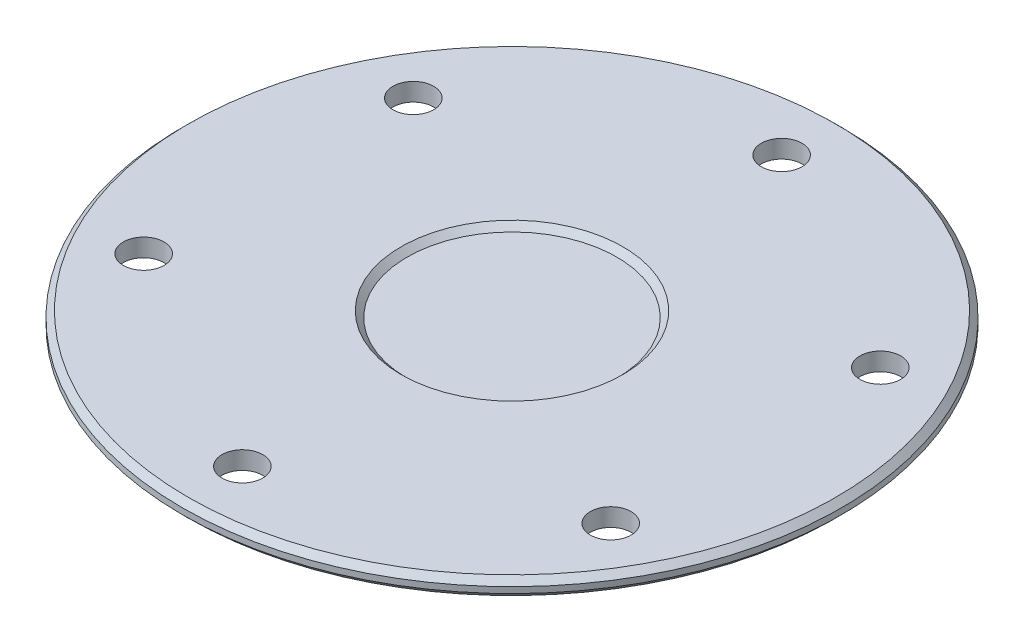
ISO-10303-21;
HEADER;
FILE_DESCRIPTION(('STEP AP214'),'2;1');
FILE_NAME('part.step','',(''),(''),'','','');
FILE_SCHEMA(('AUTOMOTIVE_DESIGN { 1 0 10303 214 1 1 1 1 }'));
ENDSEC;
DATA;
#1=APPLICATION_CONTEXT('core data for automotive mechanical design processes');
#2=APPLICATION_PROTOCOL_DEFINITION('international standard','automotive_design',2000,#1);
#3=PRODUCT_CONTEXT('',#1,'mechanical');
#4=PRODUCT('Part','Part','',(#3));
#5=PRODUCT_RELATED_PRODUCT_CATEGORY('part','',(#4));
#6=PRODUCT_DEFINITION_FORMATION('','',#4);
#7=PRODUCT_DEFINITION_CONTEXT('part definition',#1,'design');
#8=PRODUCT_DEFINITION('design','',#6,#7);
#9=PRODUCT_DEFINITION_SHAPE('','',#8);
#10=(LENGTH_UNIT() NAMED_UNIT(*) SI_UNIT(.MILLI.,.METRE.));
#11=(NAMED_UNIT(*) PLANE_ANGLE_UNIT() SI_UNIT($,.RADIAN.));
#12=(NAMED_UNIT(*) SI_UNIT($,.STERADIAN.) SOLID_ANGLE_UNIT());
#13=UNCERTAINTY_MEASURE_WITH_UNIT(LENGTH_MEASURE(1.E-05),#10,'distance_accuracy_value','');
#14=(GEOMETRIC_REPRESENTATION_CONTEXT(3) GLOBAL_UNCERTAINTY_ASSIGNED_CONTEXT((#13)) GLOBAL_UNIT_ASSIGNED_CONTEXT((#10,
#11,#12)) REPRESENTATION_CONTEXT('',''));
#15=CARTESIAN_POINT('',(0.,0.,0.));
#16=DIRECTION('',(0.,0.,1.));
#17=DIRECTION('',(1.,0.,0.));
#18=AXIS2_PLACEMENT_3D('',#15,#16,#17);
#19=CARTESIAN_POINT('',(0.,3.,0.));
#20=DIRECTION('',(0.,-1.,0.));
#21=DIRECTION('',(0.,0.,-1.));
#22=AXIS2_PLACEMENT_3D('',#19,#20,#21);
#23=CYLINDRICAL_SURFACE('',#22,55.);
#24=CARTESIAN_POINT('',(0.,1.00000000000001,0.));
#25=DIRECTION('',(0.,1.,0.));
#26=DIRECTION('',(0.,0.,1.));
#27=AXIS2_PLACEMENT_3D('',#24,#25,#26);
#28=CIRCLE('',#27,55.);
#29=CARTESIAN_POINT('',(0.,1.00000000000001,55.));
#30=VERTEX_POINT('',#29);
#31=EDGE_CURVE('E44',#30,#30,#28,.T.);
#32=ORIENTED_EDGE('',*,*,#31,.T.);
#33=EDGE_LOOP('',(#32));
#34=FACE_BOUND('',#33,.T.);
#35=CARTESIAN_POINT('',(0.,1.99999999999997,0.));
#36=DIRECTION('',(0.,1.,0.));
#37=DIRECTION('',(0.,0.,1.));
#38=AXIS2_PLACEMENT_3D('',#35,#36,#37);
#39=CIRCLE('',#38,55.);
#40=CARTESIAN_POINT('',(0.,1.99999999999997,55.));
#41=VERTEX_POINT('',#40);
#42=EDGE_CURVE('E48',#41,#41,#39,.F.);
#43=ORIENTED_EDGE('',*,*,#42,.T.);
#44=EDGE_LOOP('',(#43));
#45=FACE_BOUND('',#44,.T.);
#46=ADVANCED_FACE('F36',(#34,#45),#23,.T.);
#47=CARTESIAN_POINT('',(0.,3.,0.));
#48=DIRECTION('',(0.,1.,0.));
#49=DIRECTION('',(0.,0.,1.));
#50=AXIS2_PLACEMENT_3D('',#47,#48,#49);
#51=PLANE('',#50);
#52=CARTESIAN_POINT('',(0.,3.,0.));
#53=DIRECTION('',(0.,1.,0.));
#54=DIRECTION('',(0.,0.,1.));
#55=AXIS2_PLACEMENT_3D('',#52,#53,#54);
#56=CIRCLE('',#55,18.5);
#57=CARTESIAN_POINT('',(0.,3.,18.5));
#58=VERTEX_POINT('',#57);
#59=EDGE_CURVE('E52',#58,#58,#56,.F.);
#60=ORIENTED_EDGE('',*,*,#59,.T.);
#61=EDGE_LOOP('',(#60));
#62=FACE_BOUND('',#61,.T.);
#63=CARTESIAN_POINT('',(0.,3.,0.));
#64=DIRECTION('',(0.,1.,0.));
#65=DIRECTION('',(0.,0.,1.));
#66=AXIS2_PLACEMENT_3D('',#63,#64,#65);
#67=CIRCLE('',#66,54.);
#68=CARTESIAN_POINT('',(0.,3.,54.));
#69=VERTEX_POINT('',#68);
#70=EDGE_CURVE('E57',#69,#69,#67,.T.);
#71=ORIENTED_EDGE('',*,*,#70,.T.);
#72=EDGE_LOOP('',(#71));
#73=FACE_BOUND('',#72,.T.);
#74=CARTESIAN_POINT('',(38.9711431702995,3.,-22.5000000000005));
#75=DIRECTION('',(0.,1.,0.));
#76=DIRECTION('',(-0.866025403784433,0.,0.50000000000001));
#77=AXIS2_PLACEMENT_3D('',#74,#75,#76);
#78=CIRCLE('',#77,3.39999999999999);
#79=CARTESIAN_POINT('',(36.0266567974324,3.,-20.8000000000004));
#80=VERTEX_POINT('',#79);
#81=EDGE_CURVE('E77',#80,#80,#78,.T.);
#82=ORIENTED_EDGE('',*,*,#81,.F.);
#83=EDGE_LOOP('',(#82));
#84=FACE_BOUND('',#83,.T.);
#85=CARTESIAN_POINT('',(38.9711431703,3.,22.4999999999996));
#86=DIRECTION('',(0.,1.,0.));
#87=DIRECTION('',(-0.866025403784443,0.,-0.499999999999992));
#88=AXIS2_PLACEMENT_3D('',#85,#86,#87);
#89=CIRCLE('',#88,3.39999999999999);
#90=CARTESIAN_POINT('',(36.0266567974328,3.,20.7999999999997));
#91=VERTEX_POINT('',#90);
#92=EDGE_CURVE('E76',#91,#91,#89,.T.);
#93=ORIENTED_EDGE('',*,*,#92,.F.);
#94=EDGE_LOOP('',(#93));
#95=FACE_BOUND('',#94,.T.);
#96=CARTESIAN_POINT('',(0.,3.,45.));
#97=DIRECTION('',(0.,1.,0.));
#98=DIRECTION('',(0.,0.,-1.));
#99=AXIS2_PLACEMENT_3D('',#96,#97,#98);
#100=CIRCLE('',#99,3.39999999999999);
#101=CARTESIAN_POINT('',(0.,3.,41.6));
#102=VERTEX_POINT('',#101);
#103=EDGE_CURVE('E84',#102,#102,#100,.T.);
#104=ORIENTED_EDGE('',*,*,#103,.F.);
#105=EDGE_LOOP('',(#104));
#106=FACE_BOUND('',#105,.T.);
#107=CARTESIAN_POINT('',(-38.9711431702996,3.,22.5000000000002));
#108=DIRECTION('',(0.,1.,0.));
#109=DIRECTION('',(0.866025403784436,0.,-0.500000000000004));
#110=AXIS2_PLACEMENT_3D('',#107,#108,#109);
#111=CIRCLE('',#110,3.39999999999999);
#112=CARTESIAN_POINT('',(-36.0266567974326,3.,20.8000000000002));
#113=VERTEX_POINT('',#112);
#114=EDGE_CURVE('E90',#113,#113,#111,.T.);
#115=ORIENTED_EDGE('',*,*,#114,.F.);
#116=EDGE_LOOP('',(#115));
#117=FACE_BOUND('',#116,.T.);
#118=CARTESIAN_POINT('',(-38.9711431702998,3.,-22.4999999999999));
#119=DIRECTION('',(0.,1.,0.));
#120=DIRECTION('',(0.86602540378444,0.,0.499999999999998));
#121=AXIS2_PLACEMENT_3D('',#118,#119,#120);
#122=CIRCLE('',#121,3.39999999999999);
#123=CARTESIAN_POINT('',(-36.0266567974327,3.,-20.7999999999999));
#124=VERTEX_POINT('',#123);
#125=EDGE_CURVE('E69',#124,#124,#122,.T.);
#126=ORIENTED_EDGE('',*,*,#125,.F.);
#127=EDGE_LOOP('',(#126));
#128=FACE_BOUND('',#127,.T.);
#129=CARTESIAN_POINT('',(0.,3.,-45.));
#130=DIRECTION('',(0.,1.,0.));
#131=DIRECTION('',(0.,0.,1.));
#132=AXIS2_PLACEMENT_3D('',#129,#130,#131);
#133=CIRCLE('',#132,3.39999999999999);
#134=CARTESIAN_POINT('',(0.,3.,-41.6));
#135=VERTEX_POINT('',#134);
#136=EDGE_CURVE('E63',#135,#135,#133,.T.);
#137=ORIENTED_EDGE('',*,*,#136,.F.);
#138=EDGE_LOOP('',(#137));
#139=FACE_BOUND('',#138,.T.);
#140=ADVANCED_FACE('F118',(#62,#73,#84,#95,#106,#117,#128,#139),#51,.T.);
#141=CARTESIAN_POINT('',(0.,0.,0.));
#142=DIRECTION('',(0.,1.,0.));
#143=DIRECTION('',(0.,0.,1.));
#144=AXIS2_PLACEMENT_3D('',#141,#142,#143);
#145=PLANE('',#144);
#146=CARTESIAN_POINT('',(0.,0.,0.));
#147=DIRECTION('',(0.,1.,0.));
#148=DIRECTION('',(0.,0.,1.));
#149=AXIS2_PLACEMENT_3D('',#146,#147,#148);
#150=CIRCLE('',#149,54.);
#151=CARTESIAN_POINT('',(0.,0.,54.));
#152=VERTEX_POINT('',#151);
#153=EDGE_CURVE('E10',#152,#152,#150,.F.);
#154=ORIENTED_EDGE('',*,*,#153,.T.);
#155=EDGE_LOOP('',(#154));
#156=FACE_BOUND('',#155,.T.);
#157=CARTESIAN_POINT('',(38.9711431702995,0.,-22.5000000000005));
#158=DIRECTION('',(0.,1.,0.));
#159=DIRECTION('',(-0.866025403784433,0.,0.50000000000001));
#160=AXIS2_PLACEMENT_3D('',#157,#158,#159);
#161=CIRCLE('',#160,3.39999999999999);
#162=CARTESIAN_POINT('',(36.0266567974324,0.,-20.8000000000004));
#163=VERTEX_POINT('',#162);
#164=EDGE_CURVE('E73',#163,#163,#161,.T.);
#165=ORIENTED_EDGE('',*,*,#164,.T.);
#166=EDGE_LOOP('',(#165));
#167=FACE_BOUND('',#166,.T.);
#168=CARTESIAN_POINT('',(38.9711431703,0.,22.4999999999996));
#169=DIRECTION('',(0.,1.,0.));
#170=DIRECTION('',(-0.866025403784443,0.,-0.499999999999992));
#171=AXIS2_PLACEMENT_3D('',#168,#169,#170);
#172=CIRCLE('',#171,3.39999999999999);
#173=CARTESIAN_POINT('',(36.0266567974329,0.,20.7999999999997));
#174=VERTEX_POINT('',#173);
#175=EDGE_CURVE('E81',#174,#174,#172,.T.);
#176=ORIENTED_EDGE('',*,*,#175,.T.);
#177=EDGE_LOOP('',(#176));
#178=FACE_BOUND('',#177,.T.);
#179=CARTESIAN_POINT('',(0.,0.,45.));
#180=DIRECTION('',(0.,1.,0.));
#181=DIRECTION('',(0.,0.,-1.));
#182=AXIS2_PLACEMENT_3D('',#179,#180,#181);
#183=CIRCLE('',#182,3.39999999999999);
#184=CARTESIAN_POINT('',(0.,0.,41.6));
#185=VERTEX_POINT('',#184);
#186=EDGE_CURVE('E87',#185,#185,#183,.T.);
#187=ORIENTED_EDGE('',*,*,#186,.T.);
#188=EDGE_LOOP('',(#187));
#189=FACE_BOUND('',#188,.T.);
#190=CARTESIAN_POINT('',(-38.9711431702996,0.,22.5000000000002));
#191=DIRECTION('',(0.,1.,0.));
#192=DIRECTION('',(0.866025403784436,0.,-0.500000000000004));
#193=AXIS2_PLACEMENT_3D('',#190,#191,#192);
#194=CIRCLE('',#193,3.39999999999999);
#195=CARTESIAN_POINT('',(-36.0266567974326,0.,20.8000000000002));
#196=VERTEX_POINT('',#195);
#197=EDGE_CURVE('E72',#196,#196,#194,.T.);
#198=ORIENTED_EDGE('',*,*,#197,.T.);
#199=EDGE_LOOP('',(#198));
#200=FACE_BOUND('',#199,.T.);
#201=CARTESIAN_POINT('',(-38.9711431702998,0.,-22.4999999999999));
#202=DIRECTION('',(0.,1.,0.));
#203=DIRECTION('',(0.86602540378444,0.,0.499999999999998));
#204=AXIS2_PLACEMENT_3D('',#201,#202,#203);
#205=CIRCLE('',#204,3.39999999999999);
#206=CARTESIAN_POINT('',(-36.0266567974327,0.,-20.7999999999999));
#207=VERTEX_POINT('',#206);
#208=EDGE_CURVE('E66',#207,#207,#205,.T.);
#209=ORIENTED_EDGE('',*,*,#208,.T.);
#210=EDGE_LOOP('',(#209));
#211=FACE_BOUND('',#210,.T.);
#212=CARTESIAN_POINT('',(0.,0.,-45.));
#213=DIRECTION('',(0.,1.,0.));
#214=DIRECTION('',(0.,0.,1.));
#215=AXIS2_PLACEMENT_3D('',#212,#213,#214);
#216=CIRCLE('',#215,3.39999999999999);
#217=CARTESIAN_POINT('',(0.,0.,-41.6));
#218=VERTEX_POINT('',#217);
#219=EDGE_CURVE('E60',#218,#218,#216,.T.);
#220=ORIENTED_EDGE('',*,*,#219,.T.);
#221=EDGE_LOOP('',(#220));
#222=FACE_BOUND('',#221,.T.);
#223=ADVANCED_FACE('F122',(#156,#167,#178,#189,#200,#211,#222),#145,.F.);
#224=CARTESIAN_POINT('',(0.,3.,-45.));
#225=DIRECTION('',(0.,1.,0.));
#226=DIRECTION('',(0.,0.,1.));
#227=AXIS2_PLACEMENT_3D('',#224,#225,#226);
#228=CYLINDRICAL_SURFACE('',#227,3.39999999999999);
#229=ORIENTED_EDGE('',*,*,#136,.T.);
#230=EDGE_LOOP('',(#229));
#231=FACE_BOUND('',#230,.T.);
#232=ORIENTED_EDGE('',*,*,#219,.F.);
#233=EDGE_LOOP('',(#232));
#234=FACE_BOUND('',#233,.T.);
#235=ADVANCED_FACE('F128',(#231,#234),#228,.F.);
#236=CARTESIAN_POINT('',(-38.9711431702998,3.,-22.4999999999999));
#237=DIRECTION('',(0.,1.,0.));
#238=DIRECTION('',(0.86602540378444,0.,0.499999999999998));
#239=AXIS2_PLACEMENT_3D('',#236,#237,#238);
#240=CYLINDRICAL_SURFACE('',#239,3.39999999999999);
#241=ORIENTED_EDGE('',*,*,#125,.T.);
#242=EDGE_LOOP('',(#241));
#243=FACE_BOUND('',#242,.T.);
#244=ORIENTED_EDGE('',*,*,#208,.F.);
#245=EDGE_LOOP('',(#244));
#246=FACE_BOUND('',#245,.T.);
#247=ADVANCED_FACE('F132',(#243,#246),#240,.F.);
#248=CARTESIAN_POINT('',(-38.9711431702996,3.,22.5000000000002));
#249=DIRECTION('',(0.,1.,0.));
#250=DIRECTION('',(0.866025403784436,0.,-0.500000000000004));
#251=AXIS2_PLACEMENT_3D('',#248,#249,#250);
#252=CYLINDRICAL_SURFACE('',#251,3.39999999999999);
#253=ORIENTED_EDGE('',*,*,#114,.T.);
#254=EDGE_LOOP('',(#253));
#255=FACE_BOUND('',#254,.T.);
#256=ORIENTED_EDGE('',*,*,#197,.F.);
#257=EDGE_LOOP('',(#256));
#258=FACE_BOUND('',#257,.T.);
#259=ADVANCED_FACE('F136',(#255,#258),#252,.F.);
#260=CARTESIAN_POINT('',(0.,3.,45.));
#261=DIRECTION('',(0.,1.,0.));
#262=DIRECTION('',(0.,0.,-1.));
#263=AXIS2_PLACEMENT_3D('',#260,#261,#262);
#264=CYLINDRICAL_SURFACE('',#263,3.39999999999999);
#265=ORIENTED_EDGE('',*,*,#103,.T.);
#266=EDGE_LOOP('',(#265));
#267=FACE_BOUND('',#266,.T.);
#268=ORIENTED_EDGE('',*,*,#186,.F.);
#269=EDGE_LOOP('',(#268));
#270=FACE_BOUND('',#269,.T.);
#271=ADVANCED_FACE('F144',(#267,#270),#264,.F.);
#272=CARTESIAN_POINT('',(38.9711431703,3.,22.4999999999996));
#273=DIRECTION('',(0.,1.,0.));
#274=DIRECTION('',(-0.866025403784443,0.,-0.499999999999992));
#275=AXIS2_PLACEMENT_3D('',#272,#273,#274);
#276=CYLINDRICAL_SURFACE('',#275,3.39999999999999);
#277=ORIENTED_EDGE('',*,*,#92,.T.);
#278=EDGE_LOOP('',(#277));
#279=FACE_BOUND('',#278,.T.);
#280=ORIENTED_EDGE('',*,*,#175,.F.);
#281=EDGE_LOOP('',(#280));
#282=FACE_BOUND('',#281,.T.);
#283=ADVANCED_FACE('F140',(#279,#282),#276,.F.);
#284=CARTESIAN_POINT('',(38.9711431702995,3.,-22.5000000000005));
#285=DIRECTION('',(0.,1.,0.));
#286=DIRECTION('',(-0.866025403784433,0.,0.50000000000001));
#287=AXIS2_PLACEMENT_3D('',#284,#285,#286);
#288=CYLINDRICAL_SURFACE('',#287,3.39999999999999);
#289=ORIENTED_EDGE('',*,*,#81,.T.);
#290=EDGE_LOOP('',(#289));
#291=FACE_BOUND('',#290,.T.);
#292=ORIENTED_EDGE('',*,*,#164,.F.);
#293=EDGE_LOOP('',(#292));
#294=FACE_BOUND('',#293,.T.);
#295=ADVANCED_FACE('F112',(#291,#294),#288,.F.);
#296=CARTESIAN_POINT('',(0.,2.,0.));
#297=DIRECTION('',(0.,1.,0.));
#298=DIRECTION('',(0.,0.,1.));
#299=AXIS2_PLACEMENT_3D('',#296,#297,#298);
#300=PLANE('',#299);
#301=CARTESIAN_POINT('',(0.,2.,0.));
#302=DIRECTION('',(0.,1.,0.));
#303=DIRECTION('',(0.,0.,1.));
#304=AXIS2_PLACEMENT_3D('',#301,#302,#303);
#305=CIRCLE('',#304,17.5);
#306=CARTESIAN_POINT('',(0.,2.,17.5));
#307=VERTEX_POINT('',#306);
#308=EDGE_CURVE('E80',#307,#307,#305,.T.);
#309=ORIENTED_EDGE('',*,*,#308,.T.);
#310=EDGE_LOOP('',(#309));
#311=FACE_BOUND('',#310,.T.);
#312=ADVANCED_FACE('F100',(#311),#300,.T.);
#313=CARTESIAN_POINT('',(0.,1.99999999999997,0.));
#314=DIRECTION('',(0.,1.,0.));
#315=DIRECTION('',(0.,0.,1.));
#316=AXIS2_PLACEMENT_3D('',#313,#314,#315);
#317=CONICAL_SURFACE('',#316,17.5,0.785398163397447);
#318=ORIENTED_EDGE('',*,*,#59,.F.);
#319=EDGE_LOOP('',(#318));
#320=FACE_BOUND('',#319,.T.);
#321=ORIENTED_EDGE('',*,*,#308,.F.);
#322=EDGE_LOOP('',(#321));
#323=FACE_BOUND('',#322,.T.);
#324=ADVANCED_FACE('F102',(#320,#323),#317,.F.);
#325=CARTESIAN_POINT('',(0.,1.00000000000001,0.));
#326=DIRECTION('',(0.,1.,0.));
#327=DIRECTION('',(0.,0.,1.));
#328=AXIS2_PLACEMENT_3D('',#325,#326,#327);
#329=CONICAL_SURFACE('',#328,55.,0.785398163397445);
#330=ORIENTED_EDGE('',*,*,#153,.F.);
#331=EDGE_LOOP('',(#330));
#332=FACE_BOUND('',#331,.T.);
#333=ORIENTED_EDGE('',*,*,#31,.F.);
#334=EDGE_LOOP('',(#333));
#335=FACE_BOUND('',#334,.T.);
#336=ADVANCED_FACE('F104',(#332,#335),#329,.T.);
#337=CARTESIAN_POINT('',(0.,3.,0.));
#338=DIRECTION('',(0.,-1.,0.));
#339=DIRECTION('',(0.,0.,-1.));
#340=AXIS2_PLACEMENT_3D('',#337,#338,#339);
#341=CONICAL_SURFACE('',#340,54.,0.785398163397448);
#342=ORIENTED_EDGE('',*,*,#42,.F.);
#343=EDGE_LOOP('',(#342));
#344=FACE_BOUND('',#343,.T.);
#345=ORIENTED_EDGE('',*,*,#70,.F.);
#346=EDGE_LOOP('',(#345));
#347=FACE_BOUND('',#346,.T.);
#348=ADVANCED_FACE('F39',(#344,#347),#341,.T.);
#349=CLOSED_SHELL('',(#46,#140,#223,#235,#247,#259,#271,#283,#295,#312,#324,#336,#348));
#350=MANIFOLD_SOLID_BREP('B2',#349);
#351=ADVANCED_BREP_SHAPE_REPRESENTATION('',(#18,#350),#14);
#352=SHAPE_DEFINITION_REPRESENTATION(#9,#351);
ENDSEC;
END-ISO-10303-21;
